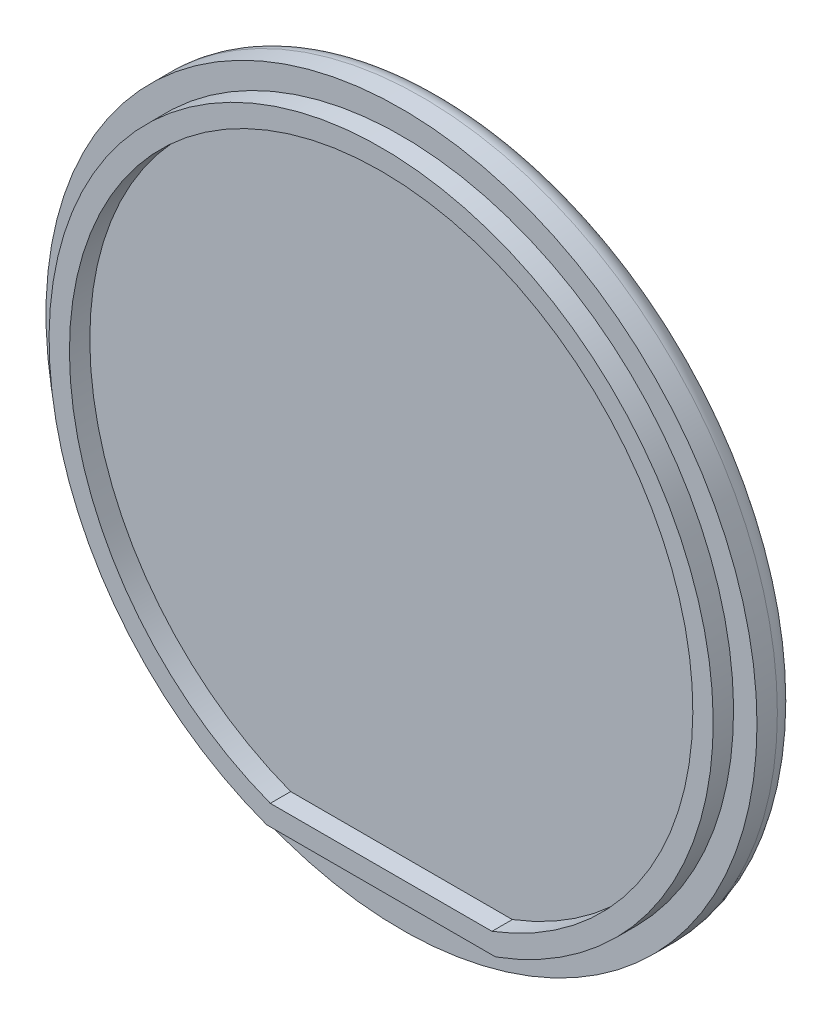
ISO-10303-21;
HEADER;
FILE_DESCRIPTION(('STEP AP214'),'2;1');
FILE_NAME('part.step','',(''),(''),'','','');
FILE_SCHEMA(('AUTOMOTIVE_DESIGN { 1 0 10303 214 1 1 1 1 }'));
ENDSEC;
DATA;
#1=APPLICATION_CONTEXT('core data for automotive mechanical design processes');
#2=APPLICATION_PROTOCOL_DEFINITION('international standard','automotive_design',2000,#1);
#3=PRODUCT_CONTEXT('',#1,'mechanical');
#4=PRODUCT('Part','Part','',(#3));
#5=PRODUCT_RELATED_PRODUCT_CATEGORY('part','',(#4));
#6=PRODUCT_DEFINITION_FORMATION('','',#4);
#7=PRODUCT_DEFINITION_CONTEXT('part definition',#1,'design');
#8=PRODUCT_DEFINITION('design','',#6,#7);
#9=PRODUCT_DEFINITION_SHAPE('','',#8);
#10=(LENGTH_UNIT() NAMED_UNIT(*) SI_UNIT(.MILLI.,.METRE.));
#11=(NAMED_UNIT(*) PLANE_ANGLE_UNIT() SI_UNIT($,.RADIAN.));
#12=(NAMED_UNIT(*) SI_UNIT($,.STERADIAN.) SOLID_ANGLE_UNIT());
#13=UNCERTAINTY_MEASURE_WITH_UNIT(LENGTH_MEASURE(1.E-05),#10,'distance_accuracy_value','');
#14=(GEOMETRIC_REPRESENTATION_CONTEXT(3) GLOBAL_UNCERTAINTY_ASSIGNED_CONTEXT((#13)) GLOBAL_UNIT_ASSIGNED_CONTEXT((#10,
#11,#12)) REPRESENTATION_CONTEXT('',''));
#15=CARTESIAN_POINT('',(0.,0.,0.));
#16=DIRECTION('',(0.,0.,1.));
#17=DIRECTION('',(1.,0.,0.));
#18=AXIS2_PLACEMENT_3D('',#15,#16,#17);
#19=CARTESIAN_POINT('',(0.,0.,4.));
#20=DIRECTION('',(0.,0.,1.));
#21=DIRECTION('',(1.,0.,0.));
#22=AXIS2_PLACEMENT_3D('',#19,#20,#21);
#23=PLANE('',#22);
#24=CARTESIAN_POINT('',(0.,0.,4.));
#25=DIRECTION('',(0.,0.,1.));
#26=DIRECTION('',(1.,0.,0.));
#27=AXIS2_PLACEMENT_3D('',#24,#25,#26);
#28=CIRCLE('',#27,32.6);
#29=CARTESIAN_POINT('',(-11.2417635652468,-30.6003717615177,4.));
#30=VERTEX_POINT('',#29);
#31=CARTESIAN_POINT('',(11.2417635652468,-30.6003717615177,4.));
#32=VERTEX_POINT('',#31);
#33=EDGE_CURVE('E48',#30,#32,#28,.F.);
#34=ORIENTED_EDGE('',*,*,#33,.T.);
#35=DIRECTION('',(1.,0.,0.));
#36=VECTOR('',#35,1.);
#37=CARTESIAN_POINT('',(0.,-30.6003717615177,4.));
#38=LINE('',#37,#36);
#39=EDGE_CURVE('E173',#30,#32,#38,.T.);
#40=ORIENTED_EDGE('',*,*,#39,.F.);
#41=EDGE_LOOP('',(#34,#40));
#42=FACE_BOUND('',#41,.T.);
#43=CARTESIAN_POINT('',(0.,0.,4.));
#44=DIRECTION('',(0.,0.,1.));
#45=DIRECTION('',(1.,0.,0.));
#46=AXIS2_PLACEMENT_3D('',#43,#44,#45);
#47=CIRCLE('',#46,34.9);
#48=CARTESIAN_POINT('',(34.9,0.,4.));
#49=VERTEX_POINT('',#48);
#50=EDGE_CURVE('E235',#49,#49,#47,.T.);
#51=ORIENTED_EDGE('',*,*,#50,.T.);
#52=EDGE_LOOP('',(#51));
#53=FACE_BOUND('',#52,.T.);
#54=ADVANCED_FACE('F33',(#42,#53),#23,.T.);
#55=CARTESIAN_POINT('',(4.50000000000001,-7.5,-20.));
#56=DIRECTION('',(0.,1.,0.));
#57=DIRECTION('',(0.,0.,1.));
#58=AXIS2_PLACEMENT_3D('',#55,#56,#57);
#59=PLANE('',#58);
#60=DIRECTION('',(0.,0.,1.));
#61=VECTOR('',#60,1.);
#62=CARTESIAN_POINT('',(4.50000000000001,-7.5,-20.));
#63=LINE('',#62,#61);
#64=CARTESIAN_POINT('',(4.50000000000001,-7.50000000000001,-8.44000000000001));
#65=VERTEX_POINT('',#64);
#66=CARTESIAN_POINT('',(4.50000000000001,-7.5,-5.));
#67=VERTEX_POINT('',#66);
#68=EDGE_CURVE('E232',#65,#67,#63,.T.);
#69=ORIENTED_EDGE('',*,*,#68,.T.);
#70=DIRECTION('',(-1.,0.,0.));
#71=VECTOR('',#70,1.);
#72=CARTESIAN_POINT('',(1.50000000000001,-7.5,-5.));
#73=LINE('',#72,#71);
#74=CARTESIAN_POINT('',(1.50000000000001,-7.5,-5.));
#75=VERTEX_POINT('',#74);
#76=EDGE_CURVE('E265',#67,#75,#73,.T.);
#77=ORIENTED_EDGE('',*,*,#76,.T.);
#78=DIRECTION('',(0.,0.,1.));
#79=VECTOR('',#78,1.);
#80=CARTESIAN_POINT('',(1.50000000000001,-7.5,-20.));
#81=LINE('',#80,#79);
#82=CARTESIAN_POINT('',(1.50000000000001,-7.50000000000001,-8.44000000000001));
#83=VERTEX_POINT('',#82);
#84=EDGE_CURVE('E229',#83,#75,#81,.T.);
#85=ORIENTED_EDGE('',*,*,#84,.F.);
#86=DIRECTION('',(1.,0.,0.));
#87=VECTOR('',#86,1.);
#88=CARTESIAN_POINT('',(-34.9,-7.50000000000001,-8.44000000000001));
#89=LINE('',#88,#87);
#90=EDGE_CURVE('E193',#83,#65,#89,.T.);
#91=ORIENTED_EDGE('',*,*,#90,.T.);
#92=EDGE_LOOP('',(#69,#77,#85,#91));
#93=FACE_BOUND('',#92,.T.);
#94=ADVANCED_FACE('F305',(#93),#59,.F.);
#95=CARTESIAN_POINT('',(-4.50000000000001,-7.5,-20.));
#96=DIRECTION('',(0.,1.,0.));
#97=DIRECTION('',(0.,0.,1.));
#98=AXIS2_PLACEMENT_3D('',#95,#96,#97);
#99=PLANE('',#98);
#100=DIRECTION('',(0.,0.,1.));
#101=VECTOR('',#100,1.);
#102=CARTESIAN_POINT('',(-1.50000000000001,-7.5,-20.));
#103=LINE('',#102,#101);
#104=CARTESIAN_POINT('',(-1.50000000000001,-7.50000000000001,-8.44000000000001));
#105=VERTEX_POINT('',#104);
#106=CARTESIAN_POINT('',(-1.50000000000001,-7.5,-5.));
#107=VERTEX_POINT('',#106);
#108=EDGE_CURVE('E215',#105,#107,#103,.T.);
#109=ORIENTED_EDGE('',*,*,#108,.T.);
#110=DIRECTION('',(-1.,0.,0.));
#111=VECTOR('',#110,1.);
#112=CARTESIAN_POINT('',(-4.50000000000001,-7.5,-5.));
#113=LINE('',#112,#111);
#114=CARTESIAN_POINT('',(-4.50000000000001,-7.5,-5.));
#115=VERTEX_POINT('',#114);
#116=EDGE_CURVE('E258',#107,#115,#113,.T.);
#117=ORIENTED_EDGE('',*,*,#116,.T.);
#118=DIRECTION('',(0.,0.,1.));
#119=VECTOR('',#118,1.);
#120=CARTESIAN_POINT('',(-4.50000000000001,-7.5,-20.));
#121=LINE('',#120,#119);
#122=CARTESIAN_POINT('',(-4.50000000000001,-7.5,-8.44000000000001));
#123=VERTEX_POINT('',#122);
#124=EDGE_CURVE('E212',#123,#115,#121,.T.);
#125=ORIENTED_EDGE('',*,*,#124,.F.);
#126=EDGE_CURVE('E198',#123,#105,#89,.T.);
#127=ORIENTED_EDGE('',*,*,#126,.T.);
#128=EDGE_LOOP('',(#109,#117,#125,#127));
#129=FACE_BOUND('',#128,.T.);
#130=ADVANCED_FACE('F310',(#129),#99,.F.);
#131=CARTESIAN_POINT('',(0.,0.,0.));
#132=DIRECTION('',(0.,0.,1.));
#133=DIRECTION('',(1.,0.,0.));
#134=AXIS2_PLACEMENT_3D('',#131,#132,#133);
#135=PLANE('',#134);
#136=CARTESIAN_POINT('',(0.,0.,0.));
#137=DIRECTION('',(0.,0.,1.));
#138=DIRECTION('',(1.,0.,0.));
#139=AXIS2_PLACEMENT_3D('',#136,#137,#138);
#140=CIRCLE('',#139,32.9);
#141=CARTESIAN_POINT('',(32.9,0.,0.));
#142=VERTEX_POINT('',#141);
#143=EDGE_CURVE('E11',#142,#142,#140,.F.);
#144=ORIENTED_EDGE('',*,*,#143,.T.);
#145=EDGE_LOOP('',(#144));
#146=FACE_BOUND('',#145,.T.);
#147=DIRECTION('',(1.,0.,0.));
#148=VECTOR('',#147,1.);
#149=CARTESIAN_POINT('',(1.50000000000001,12.5,0.));
#150=LINE('',#149,#148);
#151=CARTESIAN_POINT('',(9.50000000000001,12.5,0.));
#152=VERTEX_POINT('',#151);
#153=CARTESIAN_POINT('',(1.50000000000001,12.5,0.));
#154=VERTEX_POINT('',#153);
#155=EDGE_CURVE('E248',#152,#154,#150,.F.);
#156=ORIENTED_EDGE('',*,*,#155,.T.);
#157=DIRECTION('',(0.,1.,0.));
#158=VECTOR('',#157,1.);
#159=CARTESIAN_POINT('',(1.50000000000001,7.5,0.));
#160=LINE('',#159,#158);
#161=CARTESIAN_POINT('',(1.50000000000001,-12.5,0.));
#162=VERTEX_POINT('',#161);
#163=EDGE_CURVE('E221',#162,#154,#160,.T.);
#164=ORIENTED_EDGE('',*,*,#163,.F.);
#165=DIRECTION('',(-1.,0.,0.));
#166=VECTOR('',#165,1.);
#167=CARTESIAN_POINT('',(4.50000000000001,-12.5,0.));
#168=LINE('',#167,#166);
#169=CARTESIAN_POINT('',(9.50000000000001,-12.5,0.));
#170=VERTEX_POINT('',#169);
#171=EDGE_CURVE('E246',#162,#170,#168,.F.);
#172=ORIENTED_EDGE('',*,*,#171,.T.);
#173=DIRECTION('',(0.,-1.,0.));
#174=VECTOR('',#173,1.);
#175=CARTESIAN_POINT('',(9.50000000000001,7.5,0.));
#176=LINE('',#175,#174);
#177=EDGE_CURVE('E244',#170,#152,#176,.F.);
#178=ORIENTED_EDGE('',*,*,#177,.T.);
#179=EDGE_LOOP('',(#156,#164,#172,#178));
#180=FACE_BOUND('',#179,.T.);
#181=DIRECTION('',(-1.,0.,0.));
#182=VECTOR('',#181,1.);
#183=CARTESIAN_POINT('',(-1.50000000000001,-12.5,0.));
#184=LINE('',#183,#182);
#185=CARTESIAN_POINT('',(-9.50000000000001,-12.5,0.));
#186=VERTEX_POINT('',#185);
#187=CARTESIAN_POINT('',(-1.50000000000001,-12.5,0.));
#188=VERTEX_POINT('',#187);
#189=EDGE_CURVE('E253',#186,#188,#184,.F.);
#190=ORIENTED_EDGE('',*,*,#189,.T.);
#191=DIRECTION('',(0.,-1.,0.));
#192=VECTOR('',#191,1.);
#193=CARTESIAN_POINT('',(-1.50000000000001,7.5,0.));
#194=LINE('',#193,#192);
#195=CARTESIAN_POINT('',(-1.50000000000001,12.5,0.));
#196=VERTEX_POINT('',#195);
#197=EDGE_CURVE('E207',#196,#188,#194,.T.);
#198=ORIENTED_EDGE('',*,*,#197,.F.);
#199=DIRECTION('',(1.,0.,0.));
#200=VECTOR('',#199,1.);
#201=CARTESIAN_POINT('',(-4.50000000000001,12.5,0.));
#202=LINE('',#201,#200);
#203=CARTESIAN_POINT('',(-9.50000000000001,12.5,0.));
#204=VERTEX_POINT('',#203);
#205=EDGE_CURVE('E256',#196,#204,#202,.F.);
#206=ORIENTED_EDGE('',*,*,#205,.T.);
#207=DIRECTION('',(0.,1.,0.));
#208=VECTOR('',#207,1.);
#209=CARTESIAN_POINT('',(-9.50000000000001,-7.5,0.));
#210=LINE('',#209,#208);
#211=EDGE_CURVE('E251',#204,#186,#210,.F.);
#212=ORIENTED_EDGE('',*,*,#211,.T.);
#213=EDGE_LOOP('',(#190,#198,#206,#212));
#214=FACE_BOUND('',#213,.T.);
#215=ADVANCED_FACE('F317',(#146,#180,#214),#135,.F.);
#216=CARTESIAN_POINT('',(0.,0.,4.));
#217=DIRECTION('',(0.,0.,-1.));
#218=DIRECTION('',(-1.,0.,0.));
#219=AXIS2_PLACEMENT_3D('',#216,#217,#218);
#220=CYLINDRICAL_SURFACE('',#219,34.9);
#221=CARTESIAN_POINT('',(0.,0.,2.));
#222=DIRECTION('',(0.,0.,1.));
#223=DIRECTION('',(1.,0.,0.));
#224=AXIS2_PLACEMENT_3D('',#221,#222,#223);
#225=CIRCLE('',#224,34.9);
#226=CARTESIAN_POINT('',(34.9,0.,2.));
#227=VERTEX_POINT('',#226);
#228=EDGE_CURVE('E41',#227,#227,#225,.T.);
#229=ORIENTED_EDGE('',*,*,#228,.T.);
#230=EDGE_LOOP('',(#229));
#231=FACE_BOUND('',#230,.T.);
#232=ORIENTED_EDGE('',*,*,#50,.F.);
#233=EDGE_LOOP('',(#232));
#234=FACE_BOUND('',#233,.T.);
#235=ADVANCED_FACE('F292',(#231,#234),#220,.T.);
#236=CARTESIAN_POINT('',(4.50000000000001,7.5,-20.));
#237=DIRECTION('',(-1.,0.,0.));
#238=DIRECTION('',(0.,0.,1.));
#239=AXIS2_PLACEMENT_3D('',#236,#237,#238);
#240=PLANE('',#239);
#241=CARTESIAN_POINT('',(4.50000000000001,0.,-8.44));
#242=DIRECTION('',(1.,0.,0.));
#243=DIRECTION('',(0.,0.,-1.));
#244=AXIS2_PLACEMENT_3D('',#241,#242,#243);
#245=CIRCLE('',#244,2.5);
#246=CARTESIAN_POINT('',(4.50000000000001,0.,-10.94));
#247=VERTEX_POINT('',#246);
#248=EDGE_CURVE('E179',#247,#247,#245,.T.);
#249=ORIENTED_EDGE('',*,*,#248,.F.);
#250=EDGE_LOOP('',(#249));
#251=FACE_BOUND('',#250,.T.);
#252=DIRECTION('',(0.,0.,1.));
#253=VECTOR('',#252,1.);
#254=CARTESIAN_POINT('',(4.50000000000001,7.5,-20.));
#255=LINE('',#254,#253);
#256=CARTESIAN_POINT('',(4.50000000000001,7.5,-8.44));
#257=VERTEX_POINT('',#256);
#258=CARTESIAN_POINT('',(4.50000000000001,7.5,-5.));
#259=VERTEX_POINT('',#258);
#260=EDGE_CURVE('E223',#257,#259,#255,.T.);
#261=ORIENTED_EDGE('',*,*,#260,.T.);
#262=DIRECTION('',(0.,-1.,0.));
#263=VECTOR('',#262,1.);
#264=CARTESIAN_POINT('',(4.50000000000001,-7.5,-5.));
#265=LINE('',#264,#263);
#266=EDGE_CURVE('E267',#259,#67,#265,.T.);
#267=ORIENTED_EDGE('',*,*,#266,.T.);
#268=ORIENTED_EDGE('',*,*,#68,.F.);
#269=CARTESIAN_POINT('',(4.50000000000001,0.,-8.44));
#270=DIRECTION('',(-1.,0.,0.));
#271=DIRECTION('',(0.,0.,1.));
#272=AXIS2_PLACEMENT_3D('',#269,#270,#271);
#273=CIRCLE('',#272,7.5);
#274=EDGE_CURVE('E191',#257,#65,#273,.T.);
#275=ORIENTED_EDGE('',*,*,#274,.F.);
#276=EDGE_LOOP('',(#261,#267,#268,#275));
#277=FACE_BOUND('',#276,.T.);
#278=ADVANCED_FACE('F316',(#251,#277),#240,.F.);
#279=CARTESIAN_POINT('',(1.50000000000001,7.5,-20.));
#280=DIRECTION('',(1.,0.,0.));
#281=DIRECTION('',(0.,1.,0.));
#282=AXIS2_PLACEMENT_3D('',#279,#280,#281);
#283=PLANE('',#282);
#284=CARTESIAN_POINT('',(1.50000000000001,0.,-8.44));
#285=DIRECTION('',(1.,0.,0.));
#286=DIRECTION('',(0.,1.,0.));
#287=AXIS2_PLACEMENT_3D('',#284,#285,#286);
#288=CIRCLE('',#287,2.5);
#289=CARTESIAN_POINT('',(1.50000000000001,2.5,-8.44));
#290=VERTEX_POINT('',#289);
#291=EDGE_CURVE('E187',#290,#290,#288,.T.);
#292=ORIENTED_EDGE('',*,*,#291,.T.);
#293=EDGE_LOOP('',(#292));
#294=FACE_BOUND('',#293,.T.);
#295=DIRECTION('',(0.,0.,1.));
#296=VECTOR('',#295,1.);
#297=CARTESIAN_POINT('',(1.50000000000001,7.5,-20.));
#298=LINE('',#297,#296);
#299=CARTESIAN_POINT('',(1.50000000000001,7.5,-8.44));
#300=VERTEX_POINT('',#299);
#301=CARTESIAN_POINT('',(1.50000000000001,7.5,-5.));
#302=VERTEX_POINT('',#301);
#303=EDGE_CURVE('E226',#300,#302,#298,.T.);
#304=ORIENTED_EDGE('',*,*,#303,.F.);
#305=CARTESIAN_POINT('',(1.50000000000001,0.,-8.44));
#306=DIRECTION('',(1.,0.,0.));
#307=DIRECTION('',(0.,1.,0.));
#308=AXIS2_PLACEMENT_3D('',#305,#306,#307);
#309=CIRCLE('',#308,7.5);
#310=EDGE_CURVE('E204',#300,#83,#309,.F.);
#311=ORIENTED_EDGE('',*,*,#310,.T.);
#312=ORIENTED_EDGE('',*,*,#84,.T.);
#313=CARTESIAN_POINT('',(1.50000000000001,-12.5,-5.));
#314=DIRECTION('',(1.,0.,0.));
#315=DIRECTION('',(0.,1.,0.));
#316=AXIS2_PLACEMENT_3D('',#313,#314,#315);
#317=CIRCLE('',#316,5.);
#318=EDGE_CURVE('E276',#75,#162,#317,.T.);
#319=ORIENTED_EDGE('',*,*,#318,.T.);
#320=ORIENTED_EDGE('',*,*,#163,.T.);
#321=CARTESIAN_POINT('',(1.50000000000001,12.5,-5.));
#322=DIRECTION('',(1.,0.,0.));
#323=DIRECTION('',(0.,1.,0.));
#324=AXIS2_PLACEMENT_3D('',#321,#322,#323);
#325=CIRCLE('',#324,5.);
#326=EDGE_CURVE('E274',#154,#302,#325,.T.);
#327=ORIENTED_EDGE('',*,*,#326,.T.);
#328=EDGE_LOOP('',(#304,#311,#312,#319,#320,#327));
#329=FACE_BOUND('',#328,.T.);
#330=ADVANCED_FACE('F355',(#294,#329),#283,.F.);
#331=CARTESIAN_POINT('',(4.50000000000001,7.5,-20.));
#332=DIRECTION('',(0.,-1.,0.));
#333=DIRECTION('',(0.,0.,-1.));
#334=AXIS2_PLACEMENT_3D('',#331,#332,#333);
#335=PLANE('',#334);
#336=ORIENTED_EDGE('',*,*,#303,.T.);
#337=DIRECTION('',(1.,0.,0.));
#338=VECTOR('',#337,1.);
#339=CARTESIAN_POINT('',(4.50000000000001,7.5,-5.));
#340=LINE('',#339,#338);
#341=EDGE_CURVE('E262',#302,#259,#340,.T.);
#342=ORIENTED_EDGE('',*,*,#341,.T.);
#343=ORIENTED_EDGE('',*,*,#260,.F.);
#344=DIRECTION('',(1.,0.,0.));
#345=VECTOR('',#344,1.);
#346=CARTESIAN_POINT('',(-34.9,7.5,-8.44));
#347=LINE('',#346,#345);
#348=EDGE_CURVE('E195',#300,#257,#347,.T.);
#349=ORIENTED_EDGE('',*,*,#348,.F.);
#350=EDGE_LOOP('',(#336,#342,#343,#349));
#351=FACE_BOUND('',#350,.T.);
#352=ADVANCED_FACE('F366',(#351),#335,.F.);
#353=CARTESIAN_POINT('',(-4.50000000000001,7.5,-20.));
#354=DIRECTION('',(0.,-1.,0.));
#355=DIRECTION('',(0.,0.,-1.));
#356=AXIS2_PLACEMENT_3D('',#353,#354,#355);
#357=PLANE('',#356);
#358=DIRECTION('',(0.,0.,1.));
#359=VECTOR('',#358,1.);
#360=CARTESIAN_POINT('',(-4.50000000000001,7.5,-20.));
#361=LINE('',#360,#359);
#362=CARTESIAN_POINT('',(-4.50000000000001,7.5,-8.44));
#363=VERTEX_POINT('',#362);
#364=CARTESIAN_POINT('',(-4.50000000000001,7.5,-5.));
#365=VERTEX_POINT('',#364);
#366=EDGE_CURVE('E209',#363,#365,#361,.T.);
#367=ORIENTED_EDGE('',*,*,#366,.T.);
#368=DIRECTION('',(1.,0.,0.));
#369=VECTOR('',#368,1.);
#370=CARTESIAN_POINT('',(-1.50000000000001,7.5,-5.));
#371=LINE('',#370,#369);
#372=CARTESIAN_POINT('',(-1.50000000000001,7.5,-5.));
#373=VERTEX_POINT('',#372);
#374=EDGE_CURVE('E241',#365,#373,#371,.T.);
#375=ORIENTED_EDGE('',*,*,#374,.T.);
#376=DIRECTION('',(0.,0.,1.));
#377=VECTOR('',#376,1.);
#378=CARTESIAN_POINT('',(-1.50000000000001,7.5,-20.));
#379=LINE('',#378,#377);
#380=CARTESIAN_POINT('',(-1.50000000000001,7.5,-8.44));
#381=VERTEX_POINT('',#380);
#382=EDGE_CURVE('E218',#381,#373,#379,.T.);
#383=ORIENTED_EDGE('',*,*,#382,.F.);
#384=EDGE_CURVE('E197',#363,#381,#347,.T.);
#385=ORIENTED_EDGE('',*,*,#384,.F.);
#386=EDGE_LOOP('',(#367,#375,#383,#385));
#387=FACE_BOUND('',#386,.T.);
#388=ADVANCED_FACE('F392',(#387),#357,.F.);
#389=CARTESIAN_POINT('',(-1.50000000000001,7.5,-20.));
#390=DIRECTION('',(-1.,0.,0.));
#391=DIRECTION('',(0.,-1.,0.));
#392=AXIS2_PLACEMENT_3D('',#389,#390,#391);
#393=PLANE('',#392);
#394=CARTESIAN_POINT('',(-1.50000000000001,0.,-8.44));
#395=DIRECTION('',(-1.,0.,0.));
#396=DIRECTION('',(0.,-1.,0.));
#397=AXIS2_PLACEMENT_3D('',#394,#395,#396);
#398=CIRCLE('',#397,2.5);
#399=CARTESIAN_POINT('',(-1.50000000000001,-2.5,-8.44));
#400=VERTEX_POINT('',#399);
#401=EDGE_CURVE('E184',#400,#400,#398,.T.);
#402=ORIENTED_EDGE('',*,*,#401,.T.);
#403=EDGE_LOOP('',(#402));
#404=FACE_BOUND('',#403,.T.);
#405=ORIENTED_EDGE('',*,*,#108,.F.);
#406=CARTESIAN_POINT('',(-1.50000000000001,0.,-8.44));
#407=DIRECTION('',(-1.,0.,0.));
#408=DIRECTION('',(0.,-1.,0.));
#409=AXIS2_PLACEMENT_3D('',#406,#407,#408);
#410=CIRCLE('',#409,7.5);
#411=EDGE_CURVE('E201',#105,#381,#410,.F.);
#412=ORIENTED_EDGE('',*,*,#411,.T.);
#413=ORIENTED_EDGE('',*,*,#382,.T.);
#414=CARTESIAN_POINT('',(-1.50000000000001,12.5,-5.));
#415=DIRECTION('',(-1.,0.,0.));
#416=DIRECTION('',(0.,-1.,0.));
#417=AXIS2_PLACEMENT_3D('',#414,#415,#416);
#418=CIRCLE('',#417,5.);
#419=EDGE_CURVE('E269',#373,#196,#418,.T.);
#420=ORIENTED_EDGE('',*,*,#419,.T.);
#421=ORIENTED_EDGE('',*,*,#197,.T.);
#422=CARTESIAN_POINT('',(-1.50000000000001,-12.5,-5.));
#423=DIRECTION('',(-1.,0.,0.));
#424=DIRECTION('',(0.,-1.,0.));
#425=AXIS2_PLACEMENT_3D('',#422,#423,#424);
#426=CIRCLE('',#425,5.);
#427=EDGE_CURVE('E272',#188,#107,#426,.T.);
#428=ORIENTED_EDGE('',*,*,#427,.T.);
#429=EDGE_LOOP('',(#405,#412,#413,#420,#421,#428));
#430=FACE_BOUND('',#429,.T.);
#431=ADVANCED_FACE('F379',(#404,#430),#393,.F.);
#432=CARTESIAN_POINT('',(-4.50000000000001,7.5,-20.));
#433=DIRECTION('',(1.,0.,0.));
#434=DIRECTION('',(0.,0.,-1.));
#435=AXIS2_PLACEMENT_3D('',#432,#433,#434);
#436=PLANE('',#435);
#437=CARTESIAN_POINT('',(-4.50000000000001,0.,-8.44));
#438=DIRECTION('',(1.,0.,0.));
#439=DIRECTION('',(0.,0.,-1.));
#440=AXIS2_PLACEMENT_3D('',#437,#438,#439);
#441=CIRCLE('',#440,2.5);
#442=CARTESIAN_POINT('',(-4.50000000000001,0.,-10.94));
#443=VERTEX_POINT('',#442);
#444=EDGE_CURVE('E183',#443,#443,#441,.T.);
#445=ORIENTED_EDGE('',*,*,#444,.T.);
#446=EDGE_LOOP('',(#445));
#447=FACE_BOUND('',#446,.T.);
#448=ORIENTED_EDGE('',*,*,#124,.T.);
#449=DIRECTION('',(0.,1.,0.));
#450=VECTOR('',#449,1.);
#451=CARTESIAN_POINT('',(-4.50000000000001,7.5,-5.));
#452=LINE('',#451,#450);
#453=EDGE_CURVE('E260',#115,#365,#452,.T.);
#454=ORIENTED_EDGE('',*,*,#453,.T.);
#455=ORIENTED_EDGE('',*,*,#366,.F.);
#456=CARTESIAN_POINT('',(-4.50000000000001,0.,-8.44));
#457=DIRECTION('',(1.,0.,0.));
#458=DIRECTION('',(0.,0.,-1.));
#459=AXIS2_PLACEMENT_3D('',#456,#457,#458);
#460=CIRCLE('',#459,7.5);
#461=EDGE_CURVE('E238',#363,#123,#460,.F.);
#462=ORIENTED_EDGE('',*,*,#461,.T.);
#463=EDGE_LOOP('',(#448,#454,#455,#462));
#464=FACE_BOUND('',#463,.T.);
#465=ADVANCED_FACE('F388',(#447,#464),#436,.F.);
#466=CARTESIAN_POINT('',(-34.9,0.,-8.44));
#467=DIRECTION('',(1.,0.,0.));
#468=DIRECTION('',(0.,0.,-1.));
#469=AXIS2_PLACEMENT_3D('',#466,#467,#468);
#470=CYLINDRICAL_SURFACE('',#469,7.5);
#471=ORIENTED_EDGE('',*,*,#126,.F.);
#472=ORIENTED_EDGE('',*,*,#461,.F.);
#473=ORIENTED_EDGE('',*,*,#384,.T.);
#474=ORIENTED_EDGE('',*,*,#411,.F.);
#475=EDGE_LOOP('',(#471,#472,#473,#474));
#476=FACE_BOUND('',#475,.T.);
#477=ADVANCED_FACE('F384',(#476),#470,.T.);
#478=ORIENTED_EDGE('',*,*,#348,.T.);
#479=ORIENTED_EDGE('',*,*,#274,.T.);
#480=ORIENTED_EDGE('',*,*,#90,.F.);
#481=ORIENTED_EDGE('',*,*,#310,.F.);
#482=EDGE_LOOP('',(#478,#479,#480,#481));
#483=FACE_BOUND('',#482,.T.);
#484=ADVANCED_FACE('F335',(#483),#470,.T.);
#485=CARTESIAN_POINT('',(-4.50000000000001,-12.5,-5.));
#486=DIRECTION('',(1.,0.,0.));
#487=DIRECTION('',(0.,0.,-1.));
#488=AXIS2_PLACEMENT_3D('',#485,#486,#487);
#489=CYLINDRICAL_SURFACE('',#488,5.);
#490=ORIENTED_EDGE('',*,*,#427,.F.);
#491=ORIENTED_EDGE('',*,*,#189,.F.);
#492=CARTESIAN_POINT('',(-9.50000000000001,-12.5,-5.));
#493=DIRECTION('',(0.707106781186547,-0.707106781186547,0.));
#494=DIRECTION('',(-0.707106781186547,-0.707106781186547,0.));
#495=AXIS2_PLACEMENT_3D('',#492,#493,#494);
#496=ELLIPSE('',#495,7.07106781186547,5.);
#497=EDGE_CURVE('E194',#115,#186,#496,.T.);
#498=ORIENTED_EDGE('',*,*,#497,.F.);
#499=ORIENTED_EDGE('',*,*,#116,.F.);
#500=EDGE_LOOP('',(#490,#491,#498,#499));
#501=FACE_BOUND('',#500,.T.);
#502=ADVANCED_FACE('F331',(#501),#489,.F.);
#503=CARTESIAN_POINT('',(-9.50000000000001,7.5,-5.));
#504=DIRECTION('',(0.,-1.,0.));
#505=DIRECTION('',(0.,0.,-1.));
#506=AXIS2_PLACEMENT_3D('',#503,#504,#505);
#507=CYLINDRICAL_SURFACE('',#506,5.);
#508=ORIENTED_EDGE('',*,*,#497,.T.);
#509=ORIENTED_EDGE('',*,*,#211,.F.);
#510=CARTESIAN_POINT('',(-9.50000000000001,12.5,-5.));
#511=DIRECTION('',(-0.707106781186547,-0.707106781186547,0.));
#512=DIRECTION('',(0.707106781186547,-0.707106781186547,0.));
#513=AXIS2_PLACEMENT_3D('',#510,#511,#512);
#514=ELLIPSE('',#513,7.07106781186547,5.);
#515=EDGE_CURVE('E279',#365,#204,#514,.T.);
#516=ORIENTED_EDGE('',*,*,#515,.F.);
#517=ORIENTED_EDGE('',*,*,#453,.F.);
#518=EDGE_LOOP('',(#508,#509,#516,#517));
#519=FACE_BOUND('',#518,.T.);
#520=ADVANCED_FACE('F327',(#519),#507,.F.);
#521=CARTESIAN_POINT('',(-4.50000000000001,12.5,-5.));
#522=DIRECTION('',(-1.,0.,0.));
#523=DIRECTION('',(0.,0.,1.));
#524=AXIS2_PLACEMENT_3D('',#521,#522,#523);
#525=CYLINDRICAL_SURFACE('',#524,5.);
#526=ORIENTED_EDGE('',*,*,#515,.T.);
#527=ORIENTED_EDGE('',*,*,#205,.F.);
#528=ORIENTED_EDGE('',*,*,#419,.F.);
#529=ORIENTED_EDGE('',*,*,#374,.F.);
#530=EDGE_LOOP('',(#526,#527,#528,#529));
#531=FACE_BOUND('',#530,.T.);
#532=ADVANCED_FACE('F323',(#531),#525,.F.);
#533=CARTESIAN_POINT('',(4.50000000000001,-12.5,-5.));
#534=DIRECTION('',(1.,0.,0.));
#535=DIRECTION('',(0.,0.,-1.));
#536=AXIS2_PLACEMENT_3D('',#533,#534,#535);
#537=CYLINDRICAL_SURFACE('',#536,5.);
#538=ORIENTED_EDGE('',*,*,#318,.F.);
#539=ORIENTED_EDGE('',*,*,#76,.F.);
#540=CARTESIAN_POINT('',(9.50000000000001,-12.5,-5.));
#541=DIRECTION('',(0.707106781186547,0.707106781186547,0.));
#542=DIRECTION('',(-0.707106781186547,0.707106781186547,0.));
#543=AXIS2_PLACEMENT_3D('',#540,#541,#542);
#544=ELLIPSE('',#543,7.07106781186547,5.);
#545=EDGE_CURVE('E282',#170,#67,#544,.F.);
#546=ORIENTED_EDGE('',*,*,#545,.F.);
#547=ORIENTED_EDGE('',*,*,#171,.F.);
#548=EDGE_LOOP('',(#538,#539,#546,#547));
#549=FACE_BOUND('',#548,.T.);
#550=ADVANCED_FACE('F326',(#549),#537,.F.);
#551=CARTESIAN_POINT('',(9.50000000000001,7.5,-5.));
#552=DIRECTION('',(0.,1.,0.));
#553=DIRECTION('',(0.,0.,1.));
#554=AXIS2_PLACEMENT_3D('',#551,#552,#553);
#555=CYLINDRICAL_SURFACE('',#554,5.);
#556=ORIENTED_EDGE('',*,*,#545,.T.);
#557=ORIENTED_EDGE('',*,*,#266,.F.);
#558=CARTESIAN_POINT('',(9.50000000000001,12.5,-5.));
#559=DIRECTION('',(-0.707106781186547,0.707106781186547,0.));
#560=DIRECTION('',(0.707106781186547,0.707106781186547,0.));
#561=AXIS2_PLACEMENT_3D('',#558,#559,#560);
#562=ELLIPSE('',#561,7.07106781186547,5.);
#563=EDGE_CURVE('E190',#152,#259,#562,.F.);
#564=ORIENTED_EDGE('',*,*,#563,.F.);
#565=ORIENTED_EDGE('',*,*,#177,.F.);
#566=EDGE_LOOP('',(#556,#557,#564,#565));
#567=FACE_BOUND('',#566,.T.);
#568=ADVANCED_FACE('F341',(#567),#555,.F.);
#569=CARTESIAN_POINT('',(4.50000000000001,12.5,-5.));
#570=DIRECTION('',(-1.,0.,0.));
#571=DIRECTION('',(0.,0.,1.));
#572=AXIS2_PLACEMENT_3D('',#569,#570,#571);
#573=CYLINDRICAL_SURFACE('',#572,5.);
#574=ORIENTED_EDGE('',*,*,#326,.F.);
#575=ORIENTED_EDGE('',*,*,#155,.F.);
#576=ORIENTED_EDGE('',*,*,#563,.T.);
#577=ORIENTED_EDGE('',*,*,#341,.F.);
#578=EDGE_LOOP('',(#574,#575,#576,#577));
#579=FACE_BOUND('',#578,.T.);
#580=ADVANCED_FACE('F337',(#579),#573,.F.);
#581=CARTESIAN_POINT('',(-34.9,0.,-8.44));
#582=DIRECTION('',(1.,0.,0.));
#583=DIRECTION('',(0.,0.,-1.));
#584=AXIS2_PLACEMENT_3D('',#581,#582,#583);
#585=CYLINDRICAL_SURFACE('',#584,2.5);
#586=ORIENTED_EDGE('',*,*,#444,.F.);
#587=EDGE_LOOP('',(#586));
#588=FACE_BOUND('',#587,.T.);
#589=ORIENTED_EDGE('',*,*,#401,.F.);
#590=EDGE_LOOP('',(#589));
#591=FACE_BOUND('',#590,.T.);
#592=ADVANCED_FACE('F340',(#588,#591),#585,.F.);
#593=ORIENTED_EDGE('',*,*,#248,.T.);
#594=EDGE_LOOP('',(#593));
#595=FACE_BOUND('',#594,.T.);
#596=ORIENTED_EDGE('',*,*,#291,.F.);
#597=EDGE_LOOP('',(#596));
#598=FACE_BOUND('',#597,.T.);
#599=ADVANCED_FACE('F415',(#595,#598),#585,.F.);
#600=CARTESIAN_POINT('',(0.,-28.6003717615177,6.));
#601=DIRECTION('',(0.,1.,0.));
#602=DIRECTION('',(0.,0.,1.));
#603=AXIS2_PLACEMENT_3D('',#600,#601,#602);
#604=PLANE('',#603);
#605=DIRECTION('',(1.,0.,0.));
#606=VECTOR('',#605,1.);
#607=CARTESIAN_POINT('',(0.,-28.6003717615177,4.));
#608=LINE('',#607,#606);
#609=CARTESIAN_POINT('',(-10.8801992216587,-28.6003717615177,4.));
#610=VERTEX_POINT('',#609);
#611=CARTESIAN_POINT('',(10.8801992216587,-28.6003717615177,4.));
#612=VERTEX_POINT('',#611);
#613=EDGE_CURVE('E56',#610,#612,#608,.T.);
#614=ORIENTED_EDGE('',*,*,#613,.F.);
#615=DIRECTION('',(0.,0.,-1.));
#616=VECTOR('',#615,1.);
#617=CARTESIAN_POINT('',(-10.8801992216587,-28.6003717615177,6.));
#618=LINE('',#617,#616);
#619=CARTESIAN_POINT('',(-10.8801992216587,-28.6003717615177,6.));
#620=VERTEX_POINT('',#619);
#621=EDGE_CURVE('E177',#620,#610,#618,.T.);
#622=ORIENTED_EDGE('',*,*,#621,.F.);
#623=DIRECTION('',(1.,0.,0.));
#624=VECTOR('',#623,1.);
#625=CARTESIAN_POINT('',(0.,-28.6003717615177,6.));
#626=LINE('',#625,#624);
#627=CARTESIAN_POINT('',(10.8801992216587,-28.6003717615177,6.));
#628=VERTEX_POINT('',#627);
#629=EDGE_CURVE('E159',#620,#628,#626,.T.);
#630=ORIENTED_EDGE('',*,*,#629,.T.);
#631=DIRECTION('',(0.,0.,-1.));
#632=VECTOR('',#631,1.);
#633=CARTESIAN_POINT('',(10.8801992216587,-28.6003717615177,6.));
#634=LINE('',#633,#632);
#635=EDGE_CURVE('E152',#628,#612,#634,.T.);
#636=ORIENTED_EDGE('',*,*,#635,.T.);
#637=EDGE_LOOP('',(#614,#622,#630,#636));
#638=FACE_BOUND('',#637,.T.);
#639=ADVANCED_FACE('F417',(#638),#604,.T.);
#640=CARTESIAN_POINT('',(0.,0.,6.));
#641=DIRECTION('',(0.,0.,-1.));
#642=DIRECTION('',(-1.,0.,0.));
#643=AXIS2_PLACEMENT_3D('',#640,#641,#642);
#644=CYLINDRICAL_SURFACE('',#643,32.6);
#645=ORIENTED_EDGE('',*,*,#33,.F.);
#646=DIRECTION('',(0.,0.,-1.));
#647=VECTOR('',#646,1.);
#648=CARTESIAN_POINT('',(-11.2417635652468,-30.6003717615177,6.));
#649=LINE('',#648,#647);
#650=CARTESIAN_POINT('',(-11.2417635652468,-30.6003717615177,6.));
#651=VERTEX_POINT('',#650);
#652=EDGE_CURVE('E144',#651,#30,#649,.T.);
#653=ORIENTED_EDGE('',*,*,#652,.F.);
#654=CARTESIAN_POINT('',(0.,0.,6.));
#655=DIRECTION('',(0.,0.,1.));
#656=DIRECTION('',(1.,0.,0.));
#657=AXIS2_PLACEMENT_3D('',#654,#655,#656);
#658=CIRCLE('',#657,32.6);
#659=CARTESIAN_POINT('',(11.2417635652468,-30.6003717615177,6.));
#660=VERTEX_POINT('',#659);
#661=EDGE_CURVE('E148',#651,#660,#658,.F.);
#662=ORIENTED_EDGE('',*,*,#661,.T.);
#663=DIRECTION('',(0.,0.,-1.));
#664=VECTOR('',#663,1.);
#665=CARTESIAN_POINT('',(11.2417635652468,-30.6003717615177,6.));
#666=LINE('',#665,#664);
#667=EDGE_CURVE('E153',#660,#32,#666,.T.);
#668=ORIENTED_EDGE('',*,*,#667,.T.);
#669=EDGE_LOOP('',(#645,#653,#662,#668));
#670=FACE_BOUND('',#669,.T.);
#671=ADVANCED_FACE('F146',(#670),#644,.T.);
#672=CARTESIAN_POINT('',(0.,-30.6003717615177,6.));
#673=DIRECTION('',(0.,1.,0.));
#674=DIRECTION('',(0.,0.,1.));
#675=AXIS2_PLACEMENT_3D('',#672,#673,#674);
#676=PLANE('',#675);
#677=ORIENTED_EDGE('',*,*,#39,.T.);
#678=ORIENTED_EDGE('',*,*,#667,.F.);
#679=DIRECTION('',(1.,0.,0.));
#680=VECTOR('',#679,1.);
#681=CARTESIAN_POINT('',(0.,-30.6003717615177,6.));
#682=LINE('',#681,#680);
#683=EDGE_CURVE('E156',#651,#660,#682,.T.);
#684=ORIENTED_EDGE('',*,*,#683,.F.);
#685=ORIENTED_EDGE('',*,*,#652,.T.);
#686=EDGE_LOOP('',(#677,#678,#684,#685));
#687=FACE_BOUND('',#686,.T.);
#688=ADVANCED_FACE('F157',(#687),#676,.F.);
#689=CARTESIAN_POINT('',(0.,0.,6.));
#690=DIRECTION('',(0.,0.,-1.));
#691=DIRECTION('',(-1.,0.,0.));
#692=AXIS2_PLACEMENT_3D('',#689,#690,#691);
#693=CYLINDRICAL_SURFACE('',#692,30.6);
#694=CARTESIAN_POINT('',(0.,0.,4.));
#695=DIRECTION('',(0.,0.,1.));
#696=DIRECTION('',(1.,0.,0.));
#697=AXIS2_PLACEMENT_3D('',#694,#695,#696);
#698=CIRCLE('',#697,30.6);
#699=EDGE_CURVE('E163',#610,#612,#698,.F.);
#700=ORIENTED_EDGE('',*,*,#699,.T.);
#701=ORIENTED_EDGE('',*,*,#635,.F.);
#702=CARTESIAN_POINT('',(0.,0.,6.));
#703=DIRECTION('',(0.,0.,1.));
#704=DIRECTION('',(1.,0.,0.));
#705=AXIS2_PLACEMENT_3D('',#702,#703,#704);
#706=CIRCLE('',#705,30.6);
#707=EDGE_CURVE('E170',#620,#628,#706,.F.);
#708=ORIENTED_EDGE('',*,*,#707,.F.);
#709=ORIENTED_EDGE('',*,*,#621,.T.);
#710=EDGE_LOOP('',(#700,#701,#708,#709));
#711=FACE_BOUND('',#710,.T.);
#712=ADVANCED_FACE('F517',(#711),#693,.F.);
#713=CARTESIAN_POINT('',(0.,0.,6.));
#714=DIRECTION('',(0.,0.,1.));
#715=DIRECTION('',(1.,0.,0.));
#716=AXIS2_PLACEMENT_3D('',#713,#714,#715);
#717=PLANE('',#716);
#718=ORIENTED_EDGE('',*,*,#661,.F.);
#719=ORIENTED_EDGE('',*,*,#683,.T.);
#720=EDGE_LOOP('',(#718,#719));
#721=FACE_BOUND('',#720,.T.);
#722=ORIENTED_EDGE('',*,*,#629,.F.);
#723=ORIENTED_EDGE('',*,*,#707,.T.);
#724=EDGE_LOOP('',(#722,#723));
#725=FACE_BOUND('',#724,.T.);
#726=ADVANCED_FACE('F161',(#721,#725),#717,.T.);
#727=ORIENTED_EDGE('',*,*,#613,.T.);
#728=ORIENTED_EDGE('',*,*,#699,.F.);
#729=EDGE_LOOP('',(#727,#728));
#730=FACE_BOUND('',#729,.T.);
#731=ADVANCED_FACE('F296',(#730),#23,.T.);
#732=CARTESIAN_POINT('',(0.,0.,2.));
#733=DIRECTION('',(0.,0.,1.));
#734=DIRECTION('',(1.,0.,0.));
#735=AXIS2_PLACEMENT_3D('',#732,#733,#734);
#736=TOROIDAL_SURFACE('',#735,32.9,2.);
#737=ORIENTED_EDGE('',*,*,#143,.F.);
#738=EDGE_LOOP('',(#737));
#739=FACE_BOUND('',#738,.T.);
#740=ORIENTED_EDGE('',*,*,#228,.F.);
#741=EDGE_LOOP('',(#740));
#742=FACE_BOUND('',#741,.T.);
#743=ADVANCED_FACE('F35',(#739,#742),#736,.T.);
#744=CLOSED_SHELL('',(#54,#94,#130,#215,#235,#278,#330,#352,#388,#431,#465,#477,#484,#502,#520,
#532,#550,#568,#580,#592,#599,#639,#671,#688,#712,#726,#731,#743));
#745=MANIFOLD_SOLID_BREP('B2',#744);
#746=ADVANCED_BREP_SHAPE_REPRESENTATION('',(#18,#745),#14);
#747=SHAPE_DEFINITION_REPRESENTATION(#9,#746);
ENDSEC;
END-ISO-10303-21;
